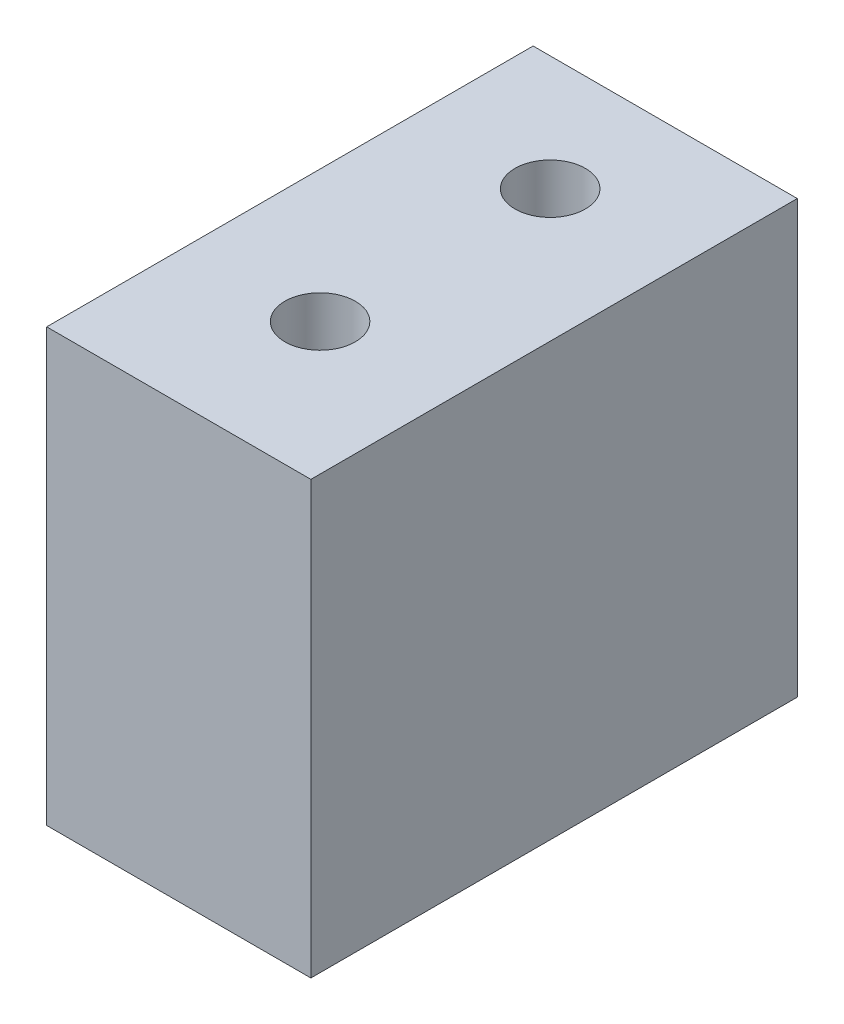
ISO-10303-21;
HEADER;
FILE_DESCRIPTION(('STEP AP214'),'2;1');
FILE_NAME('part.step','',(''),(''),'','','');
FILE_SCHEMA(('AUTOMOTIVE_DESIGN { 1 0 10303 214 1 1 1 1 }'));
ENDSEC;
DATA;
#1=APPLICATION_CONTEXT('core data for automotive mechanical design processes');
#2=APPLICATION_PROTOCOL_DEFINITION('international standard','automotive_design',2000,#1);
#3=PRODUCT_CONTEXT('',#1,'mechanical');
#4=PRODUCT('Part','Part','',(#3));
#5=PRODUCT_RELATED_PRODUCT_CATEGORY('part','',(#4));
#6=PRODUCT_DEFINITION_FORMATION('','',#4);
#7=PRODUCT_DEFINITION_CONTEXT('part definition',#1,'design');
#8=PRODUCT_DEFINITION('design','',#6,#7);
#9=PRODUCT_DEFINITION_SHAPE('','',#8);
#10=(LENGTH_UNIT() NAMED_UNIT(*) SI_UNIT(.MILLI.,.METRE.));
#11=(NAMED_UNIT(*) PLANE_ANGLE_UNIT() SI_UNIT($,.RADIAN.));
#12=(NAMED_UNIT(*) SI_UNIT($,.STERADIAN.) SOLID_ANGLE_UNIT());
#13=UNCERTAINTY_MEASURE_WITH_UNIT(LENGTH_MEASURE(1.E-05),#10,'distance_accuracy_value','');
#14=(GEOMETRIC_REPRESENTATION_CONTEXT(3) GLOBAL_UNCERTAINTY_ASSIGNED_CONTEXT((#13)) GLOBAL_UNIT_ASSIGNED_CONTEXT((#10,
#11,#12)) REPRESENTATION_CONTEXT('',''));
#15=CARTESIAN_POINT('',(0.,0.,0.));
#16=DIRECTION('',(0.,0.,1.));
#17=DIRECTION('',(1.,0.,0.));
#18=AXIS2_PLACEMENT_3D('',#15,#16,#17);
#19=CARTESIAN_POINT('',(0.,0.,-27.62));
#20=DIRECTION('',(1.,0.,0.));
#21=DIRECTION('',(0.,0.,-1.));
#22=AXIS2_PLACEMENT_3D('',#19,#20,#21);
#23=PLANE('',#22);
#24=DIRECTION('',(0.,1.,0.));
#25=VECTOR('',#24,1.);
#26=CARTESIAN_POINT('',(0.,0.,0.));
#27=LINE('',#26,#25);
#28=CARTESIAN_POINT('',(0.,0.,0.));
#29=VERTEX_POINT('',#28);
#30=CARTESIAN_POINT('',(0.,24.52,0.));
#31=VERTEX_POINT('',#30);
#32=EDGE_CURVE('E98',#29,#31,#27,.T.);
#33=ORIENTED_EDGE('',*,*,#32,.F.);
#34=DIRECTION('',(0.,0.,1.));
#35=VECTOR('',#34,1.);
#36=CARTESIAN_POINT('',(0.,0.,-27.62));
#37=LINE('',#36,#35);
#38=CARTESIAN_POINT('',(0.,0.,-27.62));
#39=VERTEX_POINT('',#38);
#40=EDGE_CURVE('E11',#39,#29,#37,.T.);
#41=ORIENTED_EDGE('',*,*,#40,.F.);
#42=DIRECTION('',(0.,1.,0.));
#43=VECTOR('',#42,1.);
#44=CARTESIAN_POINT('',(0.,0.,-27.62));
#45=LINE('',#44,#43);
#46=CARTESIAN_POINT('',(0.,24.52,-27.62));
#47=VERTEX_POINT('',#46);
#48=EDGE_CURVE('E91',#39,#47,#45,.T.);
#49=ORIENTED_EDGE('',*,*,#48,.T.);
#50=DIRECTION('',(0.,0.,1.));
#51=VECTOR('',#50,1.);
#52=CARTESIAN_POINT('',(0.,24.52,-27.62));
#53=LINE('',#52,#51);
#54=EDGE_CURVE('E36',#47,#31,#53,.T.);
#55=ORIENTED_EDGE('',*,*,#54,.T.);
#56=EDGE_LOOP('',(#33,#41,#49,#55));
#57=FACE_BOUND('',#56,.T.);
#58=ADVANCED_FACE('F33',(#57),#23,.T.);
#59=CARTESIAN_POINT('',(0.,0.,-27.62));
#60=DIRECTION('',(0.,-1.,0.));
#61=DIRECTION('',(0.,0.,-1.));
#62=AXIS2_PLACEMENT_3D('',#59,#60,#61);
#63=PLANE('',#62);
#64=CARTESIAN_POINT('',(-7.5,0.,-6.905));
#65=DIRECTION('',(0.,-1.,0.));
#66=DIRECTION('',(0.,0.,-1.));
#67=AXIS2_PLACEMENT_3D('',#64,#65,#66);
#68=CIRCLE('',#67,2.);
#69=CARTESIAN_POINT('',(-7.5,0.,-8.905));
#70=VERTEX_POINT('',#69);
#71=EDGE_CURVE('E140',#70,#70,#68,.T.);
#72=ORIENTED_EDGE('',*,*,#71,.F.);
#73=EDGE_LOOP('',(#72));
#74=FACE_BOUND('',#73,.T.);
#75=CARTESIAN_POINT('',(-7.5,0.,-20.715));
#76=DIRECTION('',(0.,-1.,0.));
#77=DIRECTION('',(0.,0.,-1.));
#78=AXIS2_PLACEMENT_3D('',#75,#76,#77);
#79=CIRCLE('',#78,2.);
#80=CARTESIAN_POINT('',(-7.5,0.,-22.715));
#81=VERTEX_POINT('',#80);
#82=EDGE_CURVE('E146',#81,#81,#79,.T.);
#83=ORIENTED_EDGE('',*,*,#82,.F.);
#84=EDGE_LOOP('',(#83));
#85=FACE_BOUND('',#84,.T.);
#86=DIRECTION('',(1.,0.,0.));
#87=VECTOR('',#86,1.);
#88=CARTESIAN_POINT('',(0.,0.,0.));
#89=LINE('',#88,#87);
#90=CARTESIAN_POINT('',(-15.,0.,0.));
#91=VERTEX_POINT('',#90);
#92=EDGE_CURVE('E93',#91,#29,#89,.T.);
#93=ORIENTED_EDGE('',*,*,#92,.F.);
#94=DIRECTION('',(0.,0.,1.));
#95=VECTOR('',#94,1.);
#96=CARTESIAN_POINT('',(-15.,0.,-27.62));
#97=LINE('',#96,#95);
#98=CARTESIAN_POINT('',(-15.,0.,-27.62));
#99=VERTEX_POINT('',#98);
#100=EDGE_CURVE('E42',#99,#91,#97,.T.);
#101=ORIENTED_EDGE('',*,*,#100,.F.);
#102=DIRECTION('',(1.,0.,0.));
#103=VECTOR('',#102,1.);
#104=CARTESIAN_POINT('',(0.,0.,-27.62));
#105=LINE('',#104,#103);
#106=EDGE_CURVE('E88',#99,#39,#105,.T.);
#107=ORIENTED_EDGE('',*,*,#106,.T.);
#108=ORIENTED_EDGE('',*,*,#40,.T.);
#109=EDGE_LOOP('',(#93,#101,#107,#108));
#110=FACE_BOUND('',#109,.T.);
#111=ADVANCED_FACE('F109',(#74,#85,#110),#63,.T.);
#112=CARTESIAN_POINT('',(-15.,0.,-27.62));
#113=DIRECTION('',(-1.,0.,0.));
#114=DIRECTION('',(0.,0.,1.));
#115=AXIS2_PLACEMENT_3D('',#112,#113,#114);
#116=PLANE('',#115);
#117=DIRECTION('',(0.,-1.,0.));
#118=VECTOR('',#117,1.);
#119=CARTESIAN_POINT('',(-15.,0.,0.));
#120=LINE('',#119,#118);
#121=CARTESIAN_POINT('',(-15.,24.52,0.));
#122=VERTEX_POINT('',#121);
#123=EDGE_CURVE('E83',#122,#91,#120,.T.);
#124=ORIENTED_EDGE('',*,*,#123,.F.);
#125=DIRECTION('',(0.,0.,1.));
#126=VECTOR('',#125,1.);
#127=CARTESIAN_POINT('',(-15.,24.52,-27.62));
#128=LINE('',#127,#126);
#129=CARTESIAN_POINT('',(-15.,24.52,-27.62));
#130=VERTEX_POINT('',#129);
#131=EDGE_CURVE('E78',#130,#122,#128,.T.);
#132=ORIENTED_EDGE('',*,*,#131,.F.);
#133=DIRECTION('',(0.,-1.,0.));
#134=VECTOR('',#133,1.);
#135=CARTESIAN_POINT('',(-15.,0.,-27.62));
#136=LINE('',#135,#134);
#137=EDGE_CURVE('E81',#130,#99,#136,.T.);
#138=ORIENTED_EDGE('',*,*,#137,.T.);
#139=ORIENTED_EDGE('',*,*,#100,.T.);
#140=EDGE_LOOP('',(#124,#132,#138,#139));
#141=FACE_BOUND('',#140,.T.);
#142=ADVANCED_FACE('F80',(#141),#116,.T.);
#143=CARTESIAN_POINT('',(0.,24.52,-27.62));
#144=DIRECTION('',(0.,1.,0.));
#145=DIRECTION('',(-1.,0.,0.));
#146=AXIS2_PLACEMENT_3D('',#143,#144,#145);
#147=PLANE('',#146);
#148=CARTESIAN_POINT('',(-7.5,24.52,-21.0875));
#149=DIRECTION('',(0.,1.,0.));
#150=DIRECTION('',(-1.,0.,0.));
#151=AXIS2_PLACEMENT_3D('',#148,#149,#150);
#152=CIRCLE('',#151,2.);
#153=CARTESIAN_POINT('',(-9.5,24.52,-21.0875));
#154=VERTEX_POINT('',#153);
#155=EDGE_CURVE('E130',#154,#154,#152,.T.);
#156=ORIENTED_EDGE('',*,*,#155,.F.);
#157=EDGE_LOOP('',(#156));
#158=FACE_BOUND('',#157,.T.);
#159=CARTESIAN_POINT('',(-7.5,24.52,-8.0225));
#160=DIRECTION('',(0.,1.,0.));
#161=DIRECTION('',(-1.,0.,0.));
#162=AXIS2_PLACEMENT_3D('',#159,#160,#161);
#163=CIRCLE('',#162,2.);
#164=CARTESIAN_POINT('',(-9.5,24.52,-8.0225));
#165=VERTEX_POINT('',#164);
#166=EDGE_CURVE('E133',#165,#165,#163,.T.);
#167=ORIENTED_EDGE('',*,*,#166,.F.);
#168=EDGE_LOOP('',(#167));
#169=FACE_BOUND('',#168,.T.);
#170=DIRECTION('',(-1.,0.,0.));
#171=VECTOR('',#170,1.);
#172=CARTESIAN_POINT('',(0.,24.52,0.));
#173=LINE('',#172,#171);
#174=EDGE_CURVE('E101',#31,#122,#173,.T.);
#175=ORIENTED_EDGE('',*,*,#174,.F.);
#176=ORIENTED_EDGE('',*,*,#54,.F.);
#177=DIRECTION('',(-1.,0.,0.));
#178=VECTOR('',#177,1.);
#179=CARTESIAN_POINT('',(0.,24.52,-27.62));
#180=LINE('',#179,#178);
#181=EDGE_CURVE('E87',#47,#130,#180,.T.);
#182=ORIENTED_EDGE('',*,*,#181,.T.);
#183=ORIENTED_EDGE('',*,*,#131,.T.);
#184=EDGE_LOOP('',(#175,#176,#182,#183));
#185=FACE_BOUND('',#184,.T.);
#186=ADVANCED_FACE('F90',(#158,#169,#185),#147,.T.);
#187=CARTESIAN_POINT('',(0.,0.,-27.62));
#188=DIRECTION('',(0.,0.,1.));
#189=DIRECTION('',(1.,0.,0.));
#190=AXIS2_PLACEMENT_3D('',#187,#188,#189);
#191=PLANE('',#190);
#192=ORIENTED_EDGE('',*,*,#48,.F.);
#193=ORIENTED_EDGE('',*,*,#106,.F.);
#194=ORIENTED_EDGE('',*,*,#137,.F.);
#195=ORIENTED_EDGE('',*,*,#181,.F.);
#196=EDGE_LOOP('',(#192,#193,#194,#195));
#197=FACE_BOUND('',#196,.T.);
#198=ADVANCED_FACE('F86',(#197),#191,.F.);
#199=CARTESIAN_POINT('',(0.,0.,0.));
#200=DIRECTION('',(0.,0.,1.));
#201=DIRECTION('',(1.,0.,0.));
#202=AXIS2_PLACEMENT_3D('',#199,#200,#201);
#203=PLANE('',#202);
#204=ORIENTED_EDGE('',*,*,#32,.T.);
#205=ORIENTED_EDGE('',*,*,#174,.T.);
#206=ORIENTED_EDGE('',*,*,#123,.T.);
#207=ORIENTED_EDGE('',*,*,#92,.T.);
#208=EDGE_LOOP('',(#204,#205,#206,#207));
#209=FACE_BOUND('',#208,.T.);
#210=ADVANCED_FACE('F108',(#209),#203,.T.);
#211=CARTESIAN_POINT('',(-7.5,21.52,-8.0225));
#212=DIRECTION('',(0.,1.,0.));
#213=DIRECTION('',(-1.,0.,0.));
#214=AXIS2_PLACEMENT_3D('',#211,#212,#213);
#215=CYLINDRICAL_SURFACE('',#214,2.);
#216=CARTESIAN_POINT('',(-7.5,21.52,-8.0225));
#217=DIRECTION('',(0.,1.,0.));
#218=DIRECTION('',(-1.,0.,0.));
#219=AXIS2_PLACEMENT_3D('',#216,#217,#218);
#220=CIRCLE('',#219,2.);
#221=CARTESIAN_POINT('',(-9.5,21.52,-8.0225));
#222=VERTEX_POINT('',#221);
#223=EDGE_CURVE('E135',#222,#222,#220,.T.);
#224=ORIENTED_EDGE('',*,*,#223,.F.);
#225=EDGE_LOOP('',(#224));
#226=FACE_BOUND('',#225,.T.);
#227=ORIENTED_EDGE('',*,*,#166,.T.);
#228=EDGE_LOOP('',(#227));
#229=FACE_BOUND('',#228,.T.);
#230=ADVANCED_FACE('F185',(#226,#229),#215,.F.);
#231=CARTESIAN_POINT('',(0.,21.52,0.));
#232=DIRECTION('',(0.,1.,0.));
#233=DIRECTION('',(-1.,0.,0.));
#234=AXIS2_PLACEMENT_3D('',#231,#232,#233);
#235=PLANE('',#234);
#236=ORIENTED_EDGE('',*,*,#223,.T.);
#237=EDGE_LOOP('',(#236));
#238=FACE_BOUND('',#237,.T.);
#239=ADVANCED_FACE('F181',(#238),#235,.T.);
#240=CARTESIAN_POINT('',(-7.5,21.52,-21.0875));
#241=DIRECTION('',(0.,1.,0.));
#242=DIRECTION('',(-1.,0.,0.));
#243=AXIS2_PLACEMENT_3D('',#240,#241,#242);
#244=CYLINDRICAL_SURFACE('',#243,2.);
#245=CARTESIAN_POINT('',(-7.5,21.52,-21.0875));
#246=DIRECTION('',(0.,1.,0.));
#247=DIRECTION('',(-1.,0.,0.));
#248=AXIS2_PLACEMENT_3D('',#245,#246,#247);
#249=CIRCLE('',#248,2.);
#250=CARTESIAN_POINT('',(-9.5,21.52,-21.0875));
#251=VERTEX_POINT('',#250);
#252=EDGE_CURVE('E102',#251,#251,#249,.T.);
#253=ORIENTED_EDGE('',*,*,#252,.F.);
#254=EDGE_LOOP('',(#253));
#255=FACE_BOUND('',#254,.T.);
#256=ORIENTED_EDGE('',*,*,#155,.T.);
#257=EDGE_LOOP('',(#256));
#258=FACE_BOUND('',#257,.T.);
#259=ADVANCED_FACE('F177',(#255,#258),#244,.F.);
#260=CARTESIAN_POINT('',(0.,21.52,0.));
#261=DIRECTION('',(0.,1.,0.));
#262=DIRECTION('',(-1.,0.,0.));
#263=AXIS2_PLACEMENT_3D('',#260,#261,#262);
#264=PLANE('',#263);
#265=ORIENTED_EDGE('',*,*,#252,.T.);
#266=EDGE_LOOP('',(#265));
#267=FACE_BOUND('',#266,.T.);
#268=ADVANCED_FACE('F173',(#267),#264,.T.);
#269=CARTESIAN_POINT('',(-7.5,3.,-20.715));
#270=DIRECTION('',(0.,-1.,0.));
#271=DIRECTION('',(0.,0.,-1.));
#272=AXIS2_PLACEMENT_3D('',#269,#270,#271);
#273=CYLINDRICAL_SURFACE('',#272,2.);
#274=CARTESIAN_POINT('',(-7.5,3.,-20.715));
#275=DIRECTION('',(0.,-1.,0.));
#276=DIRECTION('',(0.,0.,-1.));
#277=AXIS2_PLACEMENT_3D('',#274,#275,#276);
#278=CIRCLE('',#277,2.);
#279=CARTESIAN_POINT('',(-7.5,3.,-22.715));
#280=VERTEX_POINT('',#279);
#281=EDGE_CURVE('E149',#280,#280,#278,.T.);
#282=ORIENTED_EDGE('',*,*,#281,.F.);
#283=EDGE_LOOP('',(#282));
#284=FACE_BOUND('',#283,.T.);
#285=ORIENTED_EDGE('',*,*,#82,.T.);
#286=EDGE_LOOP('',(#285));
#287=FACE_BOUND('',#286,.T.);
#288=ADVANCED_FACE('F166',(#284,#287),#273,.F.);
#289=CARTESIAN_POINT('',(0.,3.,0.));
#290=DIRECTION('',(0.,-1.,0.));
#291=DIRECTION('',(0.,0.,-1.));
#292=AXIS2_PLACEMENT_3D('',#289,#290,#291);
#293=PLANE('',#292);
#294=ORIENTED_EDGE('',*,*,#281,.T.);
#295=EDGE_LOOP('',(#294));
#296=FACE_BOUND('',#295,.T.);
#297=ADVANCED_FACE('F157',(#296),#293,.T.);
#298=CARTESIAN_POINT('',(-7.5,3.,-6.905));
#299=DIRECTION('',(0.,-1.,0.));
#300=DIRECTION('',(0.,0.,-1.));
#301=AXIS2_PLACEMENT_3D('',#298,#299,#300);
#302=CYLINDRICAL_SURFACE('',#301,2.);
#303=CARTESIAN_POINT('',(-7.5,3.,-6.905));
#304=DIRECTION('',(0.,-1.,0.));
#305=DIRECTION('',(0.,0.,-1.));
#306=AXIS2_PLACEMENT_3D('',#303,#304,#305);
#307=CIRCLE('',#306,2.);
#308=CARTESIAN_POINT('',(-7.5,3.,-8.905));
#309=VERTEX_POINT('',#308);
#310=EDGE_CURVE('E136',#309,#309,#307,.T.);
#311=ORIENTED_EDGE('',*,*,#310,.F.);
#312=EDGE_LOOP('',(#311));
#313=FACE_BOUND('',#312,.T.);
#314=ORIENTED_EDGE('',*,*,#71,.T.);
#315=EDGE_LOOP('',(#314));
#316=FACE_BOUND('',#315,.T.);
#317=ADVANCED_FACE('F154',(#313,#316),#302,.F.);
#318=CARTESIAN_POINT('',(0.,3.,0.));
#319=DIRECTION('',(0.,-1.,0.));
#320=DIRECTION('',(0.,0.,-1.));
#321=AXIS2_PLACEMENT_3D('',#318,#319,#320);
#322=PLANE('',#321);
#323=ORIENTED_EDGE('',*,*,#310,.T.);
#324=EDGE_LOOP('',(#323));
#325=FACE_BOUND('',#324,.T.);
#326=ADVANCED_FACE('F156',(#325),#322,.T.);
#327=CLOSED_SHELL('',(#58,#111,#142,#186,#198,#210,#230,#239,#259,#268,#288,#297,#317,#326));
#328=MANIFOLD_SOLID_BREP('B2',#327);
#329=ADVANCED_BREP_SHAPE_REPRESENTATION('',(#18,#328),#14);
#330=SHAPE_DEFINITION_REPRESENTATION(#9,#329);
ENDSEC;
END-ISO-10303-21;
